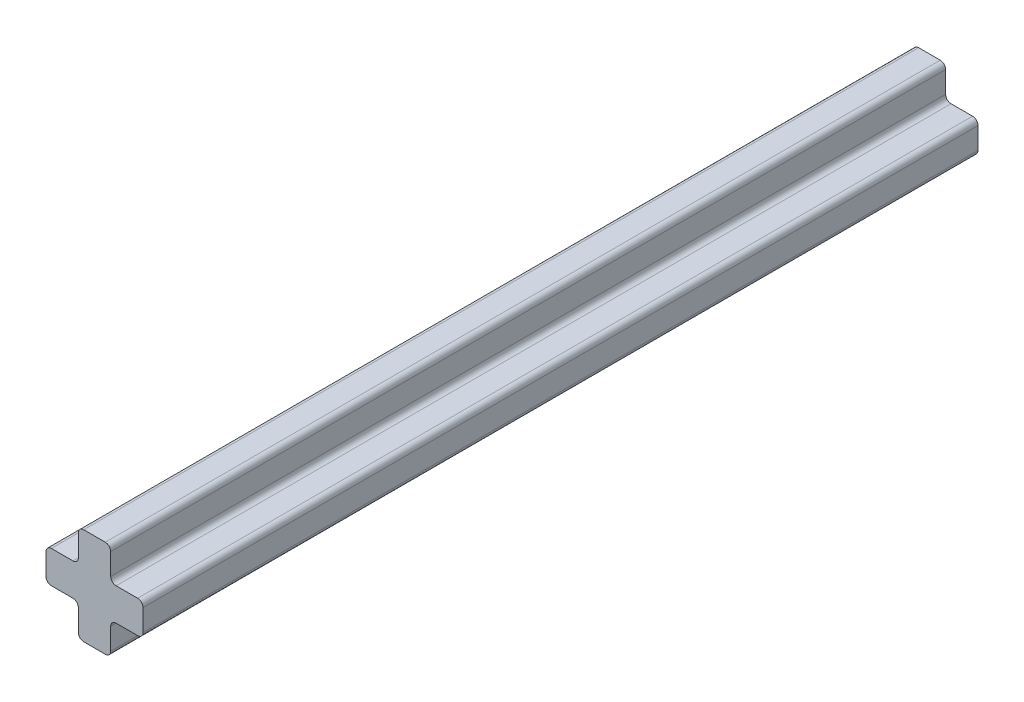
ISO-10303-21;
HEADER;
FILE_DESCRIPTION(('STEP AP214'),'2;1');
FILE_NAME('part.step','',(''),(''),'','','');
FILE_SCHEMA(('AUTOMOTIVE_DESIGN { 1 0 10303 214 1 1 1 1 }'));
ENDSEC;
DATA;
#1=APPLICATION_CONTEXT('core data for automotive mechanical design processes');
#2=APPLICATION_PROTOCOL_DEFINITION('international standard','automotive_design',2000,#1);
#3=PRODUCT_CONTEXT('',#1,'mechanical');
#4=PRODUCT('Part','Part','',(#3));
#5=PRODUCT_RELATED_PRODUCT_CATEGORY('part','',(#4));
#6=PRODUCT_DEFINITION_FORMATION('','',#4);
#7=PRODUCT_DEFINITION_CONTEXT('part definition',#1,'design');
#8=PRODUCT_DEFINITION('design','',#6,#7);
#9=PRODUCT_DEFINITION_SHAPE('','',#8);
#10=(LENGTH_UNIT() NAMED_UNIT(*) SI_UNIT(.MILLI.,.METRE.));
#11=(NAMED_UNIT(*) PLANE_ANGLE_UNIT() SI_UNIT($,.RADIAN.));
#12=(NAMED_UNIT(*) SI_UNIT($,.STERADIAN.) SOLID_ANGLE_UNIT());
#13=UNCERTAINTY_MEASURE_WITH_UNIT(LENGTH_MEASURE(1.E-05),#10,'distance_accuracy_value','');
#14=(GEOMETRIC_REPRESENTATION_CONTEXT(3) GLOBAL_UNCERTAINTY_ASSIGNED_CONTEXT((#13)) GLOBAL_UNIT_ASSIGNED_CONTEXT((#10,
#11,#12)) REPRESENTATION_CONTEXT('',''));
#15=CARTESIAN_POINT('',(0.,0.,0.));
#16=DIRECTION('',(0.,0.,1.));
#17=DIRECTION('',(1.,0.,0.));
#18=AXIS2_PLACEMENT_3D('',#15,#16,#17);
#19=CARTESIAN_POINT('',(-1.01599999999999,1.01599999999999,39.325));
#20=DIRECTION('',(0.,0.,-1.));
#21=DIRECTION('',(-1.,0.,0.));
#22=AXIS2_PLACEMENT_3D('',#19,#20,#21);
#23=CYLINDRICAL_SURFACE('',#22,0.253999999999999);
#24=CARTESIAN_POINT('',(-1.01599999999999,1.01599999999999,0.));
#25=DIRECTION('',(0.,0.,-1.));
#26=DIRECTION('',(-1.,0.,0.));
#27=AXIS2_PLACEMENT_3D('',#24,#25,#26);
#28=CIRCLE('',#27,0.253999999999999);
#29=CARTESIAN_POINT('',(-0.761999999999992,1.01599999999999,0.));
#30=VERTEX_POINT('',#29);
#31=CARTESIAN_POINT('',(-1.01599999999999,0.761999999999992,0.));
#32=VERTEX_POINT('',#31);
#33=EDGE_CURVE('E222',#30,#32,#28,.T.);
#34=ORIENTED_EDGE('',*,*,#33,.T.);
#35=DIRECTION('',(0.,0.,-1.));
#36=VECTOR('',#35,1.);
#37=CARTESIAN_POINT('',(-1.01599999999999,0.761999999999992,39.325));
#38=LINE('',#37,#36);
#39=CARTESIAN_POINT('',(-1.01599999999999,0.761999999999992,39.325));
#40=VERTEX_POINT('',#39);
#41=EDGE_CURVE('E11',#40,#32,#38,.T.);
#42=ORIENTED_EDGE('',*,*,#41,.F.);
#43=CARTESIAN_POINT('',(-1.01599999999999,1.01599999999999,39.325));
#44=DIRECTION('',(0.,0.,-1.));
#45=DIRECTION('',(-1.,0.,0.));
#46=AXIS2_PLACEMENT_3D('',#43,#44,#45);
#47=CIRCLE('',#46,0.253999999999999);
#48=CARTESIAN_POINT('',(-0.761999999999992,1.01599999999999,39.325));
#49=VERTEX_POINT('',#48);
#50=EDGE_CURVE('E268',#49,#40,#47,.T.);
#51=ORIENTED_EDGE('',*,*,#50,.F.);
#52=DIRECTION('',(0.,0.,-1.));
#53=VECTOR('',#52,1.);
#54=CARTESIAN_POINT('',(-0.761999999999992,1.01599999999999,39.325));
#55=LINE('',#54,#53);
#56=EDGE_CURVE('E218',#49,#30,#55,.T.);
#57=ORIENTED_EDGE('',*,*,#56,.T.);
#58=EDGE_LOOP('',(#34,#42,#51,#57));
#59=FACE_BOUND('',#58,.T.);
#60=ADVANCED_FACE('F30',(#59),#23,.F.);
#61=CARTESIAN_POINT('',(-1.01599999999999,0.761999999999992,39.325));
#62=DIRECTION('',(0.,-1.,0.));
#63=DIRECTION('',(0.,0.,-1.));
#64=AXIS2_PLACEMENT_3D('',#61,#62,#63);
#65=PLANE('',#64);
#66=DIRECTION('',(-1.,0.,0.));
#67=VECTOR('',#66,1.);
#68=CARTESIAN_POINT('',(-1.01599999999999,0.761999999999992,0.));
#69=LINE('',#68,#67);
#70=CARTESIAN_POINT('',(-2.032,0.761999999999994,0.));
#71=VERTEX_POINT('',#70);
#72=EDGE_CURVE('E225',#32,#71,#69,.T.);
#73=ORIENTED_EDGE('',*,*,#72,.T.);
#74=DIRECTION('',(0.,0.,-1.));
#75=VECTOR('',#74,1.);
#76=CARTESIAN_POINT('',(-2.032,0.761999999999994,39.325));
#77=LINE('',#76,#75);
#78=CARTESIAN_POINT('',(-2.032,0.761999999999994,39.325));
#79=VERTEX_POINT('',#78);
#80=EDGE_CURVE('E38',#79,#71,#77,.T.);
#81=ORIENTED_EDGE('',*,*,#80,.F.);
#82=DIRECTION('',(-1.,0.,0.));
#83=VECTOR('',#82,1.);
#84=CARTESIAN_POINT('',(-1.01599999999999,0.761999999999992,39.325));
#85=LINE('',#84,#83);
#86=EDGE_CURVE('E137',#40,#79,#85,.T.);
#87=ORIENTED_EDGE('',*,*,#86,.F.);
#88=ORIENTED_EDGE('',*,*,#41,.T.);
#89=EDGE_LOOP('',(#73,#81,#87,#88));
#90=FACE_BOUND('',#89,.T.);
#91=ADVANCED_FACE('F406',(#90),#65,.F.);
#92=CARTESIAN_POINT('',(-2.032,0.507999999999998,39.325));
#93=DIRECTION('',(0.,0.,-1.));
#94=DIRECTION('',(-1.,0.,0.));
#95=AXIS2_PLACEMENT_3D('',#92,#93,#94);
#96=CYLINDRICAL_SURFACE('',#95,0.253999999999996);
#97=CARTESIAN_POINT('',(-2.032,0.507999999999998,0.));
#98=DIRECTION('',(0.,0.,1.));
#99=DIRECTION('',(-1.,0.,0.));
#100=AXIS2_PLACEMENT_3D('',#97,#98,#99);
#101=CIRCLE('',#100,0.253999999999996);
#102=CARTESIAN_POINT('',(-2.286,0.507999999999998,0.));
#103=VERTEX_POINT('',#102);
#104=EDGE_CURVE('E227',#71,#103,#101,.T.);
#105=ORIENTED_EDGE('',*,*,#104,.T.);
#106=DIRECTION('',(0.,0.,-1.));
#107=VECTOR('',#106,1.);
#108=CARTESIAN_POINT('',(-2.286,0.507999999999998,39.325));
#109=LINE('',#108,#107);
#110=CARTESIAN_POINT('',(-2.286,0.507999999999998,39.325));
#111=VERTEX_POINT('',#110);
#112=EDGE_CURVE('E323',#111,#103,#109,.T.);
#113=ORIENTED_EDGE('',*,*,#112,.F.);
#114=CARTESIAN_POINT('',(-2.032,0.507999999999998,39.325));
#115=DIRECTION('',(0.,0.,1.));
#116=DIRECTION('',(-1.,0.,0.));
#117=AXIS2_PLACEMENT_3D('',#114,#115,#116);
#118=CIRCLE('',#117,0.253999999999996);
#119=EDGE_CURVE('E331',#79,#111,#118,.T.);
#120=ORIENTED_EDGE('',*,*,#119,.F.);
#121=ORIENTED_EDGE('',*,*,#80,.T.);
#122=EDGE_LOOP('',(#105,#113,#120,#121));
#123=FACE_BOUND('',#122,.T.);
#124=ADVANCED_FACE('F329',(#123),#96,.T.);
#125=CARTESIAN_POINT('',(-2.286,0.507999999999998,39.325));
#126=DIRECTION('',(1.,0.,0.));
#127=DIRECTION('',(0.,0.,-1.));
#128=AXIS2_PLACEMENT_3D('',#125,#126,#127);
#129=PLANE('',#128);
#130=DIRECTION('',(0.,-1.,0.));
#131=VECTOR('',#130,1.);
#132=CARTESIAN_POINT('',(-2.286,0.507999999999998,0.));
#133=LINE('',#132,#131);
#134=CARTESIAN_POINT('',(-2.28599999999999,-0.507999999999998,0.));
#135=VERTEX_POINT('',#134);
#136=EDGE_CURVE('E229',#103,#135,#133,.T.);
#137=ORIENTED_EDGE('',*,*,#136,.T.);
#138=DIRECTION('',(0.,0.,-1.));
#139=VECTOR('',#138,1.);
#140=CARTESIAN_POINT('',(-2.28599999999999,-0.507999999999998,39.325));
#141=LINE('',#140,#139);
#142=CARTESIAN_POINT('',(-2.28599999999999,-0.507999999999998,39.325));
#143=VERTEX_POINT('',#142);
#144=EDGE_CURVE('E320',#143,#135,#141,.T.);
#145=ORIENTED_EDGE('',*,*,#144,.F.);
#146=DIRECTION('',(0.,-1.,0.));
#147=VECTOR('',#146,1.);
#148=CARTESIAN_POINT('',(-2.286,0.507999999999998,39.325));
#149=LINE('',#148,#147);
#150=EDGE_CURVE('E349',#111,#143,#149,.T.);
#151=ORIENTED_EDGE('',*,*,#150,.F.);
#152=ORIENTED_EDGE('',*,*,#112,.T.);
#153=EDGE_LOOP('',(#137,#145,#151,#152));
#154=FACE_BOUND('',#153,.T.);
#155=ADVANCED_FACE('F340',(#154),#129,.F.);
#156=CARTESIAN_POINT('',(-2.032,-0.507999999999998,39.325));
#157=DIRECTION('',(0.,0.,-1.));
#158=DIRECTION('',(-1.,0.,0.));
#159=AXIS2_PLACEMENT_3D('',#156,#157,#158);
#160=CYLINDRICAL_SURFACE('',#159,0.253999999999996);
#161=CARTESIAN_POINT('',(-2.032,-0.507999999999998,0.));
#162=DIRECTION('',(0.,0.,1.));
#163=DIRECTION('',(-1.,0.,0.));
#164=AXIS2_PLACEMENT_3D('',#161,#162,#163);
#165=CIRCLE('',#164,0.253999999999996);
#166=CARTESIAN_POINT('',(-2.032,-0.761999999999992,0.));
#167=VERTEX_POINT('',#166);
#168=EDGE_CURVE('E231',#135,#167,#165,.T.);
#169=ORIENTED_EDGE('',*,*,#168,.T.);
#170=DIRECTION('',(0.,0.,-1.));
#171=VECTOR('',#170,1.);
#172=CARTESIAN_POINT('',(-2.032,-0.761999999999992,39.325));
#173=LINE('',#172,#171);
#174=CARTESIAN_POINT('',(-2.032,-0.761999999999992,39.325));
#175=VERTEX_POINT('',#174);
#176=EDGE_CURVE('E317',#175,#167,#173,.T.);
#177=ORIENTED_EDGE('',*,*,#176,.F.);
#178=CARTESIAN_POINT('',(-2.032,-0.507999999999998,39.325));
#179=DIRECTION('',(0.,0.,1.));
#180=DIRECTION('',(-1.,0.,0.));
#181=AXIS2_PLACEMENT_3D('',#178,#179,#180);
#182=CIRCLE('',#181,0.253999999999996);
#183=EDGE_CURVE('E346',#143,#175,#182,.T.);
#184=ORIENTED_EDGE('',*,*,#183,.F.);
#185=ORIENTED_EDGE('',*,*,#144,.T.);
#186=EDGE_LOOP('',(#169,#177,#184,#185));
#187=FACE_BOUND('',#186,.T.);
#188=ADVANCED_FACE('F344',(#187),#160,.T.);
#189=CARTESIAN_POINT('',(-2.032,-0.761999999999992,39.325));
#190=DIRECTION('',(0.,1.,0.));
#191=DIRECTION('',(-1.,0.,0.));
#192=AXIS2_PLACEMENT_3D('',#189,#190,#191);
#193=PLANE('',#192);
#194=DIRECTION('',(1.,0.,0.));
#195=VECTOR('',#194,1.);
#196=CARTESIAN_POINT('',(-2.032,-0.761999999999992,0.));
#197=LINE('',#196,#195);
#198=CARTESIAN_POINT('',(-1.01599999999999,-0.762000000000001,0.));
#199=VERTEX_POINT('',#198);
#200=EDGE_CURVE('E233',#167,#199,#197,.T.);
#201=ORIENTED_EDGE('',*,*,#200,.T.);
#202=DIRECTION('',(0.,0.,-1.));
#203=VECTOR('',#202,1.);
#204=CARTESIAN_POINT('',(-1.01599999999999,-0.762000000000001,39.325));
#205=LINE('',#204,#203);
#206=CARTESIAN_POINT('',(-1.01599999999999,-0.762000000000001,39.325));
#207=VERTEX_POINT('',#206);
#208=EDGE_CURVE('E314',#207,#199,#205,.T.);
#209=ORIENTED_EDGE('',*,*,#208,.F.);
#210=DIRECTION('',(1.,0.,0.));
#211=VECTOR('',#210,1.);
#212=CARTESIAN_POINT('',(-2.032,-0.761999999999992,39.325));
#213=LINE('',#212,#211);
#214=EDGE_CURVE('E348',#175,#207,#213,.T.);
#215=ORIENTED_EDGE('',*,*,#214,.F.);
#216=ORIENTED_EDGE('',*,*,#176,.T.);
#217=EDGE_LOOP('',(#201,#209,#215,#216));
#218=FACE_BOUND('',#217,.T.);
#219=ADVANCED_FACE('F419',(#218),#193,.F.);
#220=CARTESIAN_POINT('',(-1.01599999999999,-1.016,39.325));
#221=DIRECTION('',(0.,0.,-1.));
#222=DIRECTION('',(-1.,0.,0.));
#223=AXIS2_PLACEMENT_3D('',#220,#221,#222);
#224=CYLINDRICAL_SURFACE('',#223,0.253999999999999);
#225=CARTESIAN_POINT('',(-1.01599999999999,-1.016,0.));
#226=DIRECTION('',(0.,0.,-1.));
#227=DIRECTION('',(-1.,0.,0.));
#228=AXIS2_PLACEMENT_3D('',#225,#226,#227);
#229=CIRCLE('',#228,0.253999999999999);
#230=CARTESIAN_POINT('',(-0.761999999999992,-1.016,0.));
#231=VERTEX_POINT('',#230);
#232=EDGE_CURVE('E235',#199,#231,#229,.T.);
#233=ORIENTED_EDGE('',*,*,#232,.T.);
#234=DIRECTION('',(0.,0.,-1.));
#235=VECTOR('',#234,1.);
#236=CARTESIAN_POINT('',(-0.761999999999992,-1.016,39.325));
#237=LINE('',#236,#235);
#238=CARTESIAN_POINT('',(-0.761999999999992,-1.016,39.325));
#239=VERTEX_POINT('',#238);
#240=EDGE_CURVE('E311',#239,#231,#237,.T.);
#241=ORIENTED_EDGE('',*,*,#240,.F.);
#242=CARTESIAN_POINT('',(-1.01599999999999,-1.016,39.325));
#243=DIRECTION('',(0.,0.,-1.));
#244=DIRECTION('',(-1.,0.,0.));
#245=AXIS2_PLACEMENT_3D('',#242,#243,#244);
#246=CIRCLE('',#245,0.253999999999999);
#247=EDGE_CURVE('E351',#207,#239,#246,.T.);
#248=ORIENTED_EDGE('',*,*,#247,.F.);
#249=ORIENTED_EDGE('',*,*,#208,.T.);
#250=EDGE_LOOP('',(#233,#241,#248,#249));
#251=FACE_BOUND('',#250,.T.);
#252=ADVANCED_FACE('F422',(#251),#224,.F.);
#253=CARTESIAN_POINT('',(-0.761999999999992,-1.016,39.325));
#254=DIRECTION('',(1.,0.,0.));
#255=DIRECTION('',(0.,0.,-1.));
#256=AXIS2_PLACEMENT_3D('',#253,#254,#255);
#257=PLANE('',#256);
#258=DIRECTION('',(0.,-1.,0.));
#259=VECTOR('',#258,1.);
#260=CARTESIAN_POINT('',(-0.761999999999992,-1.016,0.));
#261=LINE('',#260,#259);
#262=CARTESIAN_POINT('',(-0.761999999999992,-2.032,0.));
#263=VERTEX_POINT('',#262);
#264=EDGE_CURVE('E237',#231,#263,#261,.T.);
#265=ORIENTED_EDGE('',*,*,#264,.T.);
#266=DIRECTION('',(0.,0.,-1.));
#267=VECTOR('',#266,1.);
#268=CARTESIAN_POINT('',(-0.761999999999992,-2.032,39.325));
#269=LINE('',#268,#267);
#270=CARTESIAN_POINT('',(-0.761999999999992,-2.032,39.325));
#271=VERTEX_POINT('',#270);
#272=EDGE_CURVE('E308',#271,#263,#269,.T.);
#273=ORIENTED_EDGE('',*,*,#272,.F.);
#274=DIRECTION('',(0.,-1.,0.));
#275=VECTOR('',#274,1.);
#276=CARTESIAN_POINT('',(-0.761999999999992,-1.016,39.325));
#277=LINE('',#276,#275);
#278=EDGE_CURVE('E357',#239,#271,#277,.T.);
#279=ORIENTED_EDGE('',*,*,#278,.F.);
#280=ORIENTED_EDGE('',*,*,#240,.T.);
#281=EDGE_LOOP('',(#265,#273,#279,#280));
#282=FACE_BOUND('',#281,.T.);
#283=ADVANCED_FACE('F426',(#282),#257,.F.);
#284=CARTESIAN_POINT('',(-0.507999999999995,-2.032,39.325));
#285=DIRECTION('',(0.,0.,-1.));
#286=DIRECTION('',(-1.,0.,0.));
#287=AXIS2_PLACEMENT_3D('',#284,#285,#286);
#288=CYLINDRICAL_SURFACE('',#287,0.253999999999997);
#289=CARTESIAN_POINT('',(-0.507999999999995,-2.032,0.));
#290=DIRECTION('',(0.,0.,1.));
#291=DIRECTION('',(-1.,0.,0.));
#292=AXIS2_PLACEMENT_3D('',#289,#290,#291);
#293=CIRCLE('',#292,0.253999999999997);
#294=CARTESIAN_POINT('',(-0.507999999999995,-2.28599999999999,0.));
#295=VERTEX_POINT('',#294);
#296=EDGE_CURVE('E239',#263,#295,#293,.T.);
#297=ORIENTED_EDGE('',*,*,#296,.T.);
#298=DIRECTION('',(0.,0.,-1.));
#299=VECTOR('',#298,1.);
#300=CARTESIAN_POINT('',(-0.507999999999995,-2.28599999999999,39.325));
#301=LINE('',#300,#299);
#302=CARTESIAN_POINT('',(-0.507999999999995,-2.28599999999999,39.325));
#303=VERTEX_POINT('',#302);
#304=EDGE_CURVE('E305',#303,#295,#301,.T.);
#305=ORIENTED_EDGE('',*,*,#304,.F.);
#306=CARTESIAN_POINT('',(-0.507999999999995,-2.032,39.325));
#307=DIRECTION('',(0.,0.,1.));
#308=DIRECTION('',(-1.,0.,0.));
#309=AXIS2_PLACEMENT_3D('',#306,#307,#308);
#310=CIRCLE('',#309,0.253999999999997);
#311=EDGE_CURVE('E359',#271,#303,#310,.T.);
#312=ORIENTED_EDGE('',*,*,#311,.F.);
#313=ORIENTED_EDGE('',*,*,#272,.T.);
#314=EDGE_LOOP('',(#297,#305,#312,#313));
#315=FACE_BOUND('',#314,.T.);
#316=ADVANCED_FACE('F430',(#315),#288,.T.);
#317=CARTESIAN_POINT('',(-0.507999999999995,-2.28599999999999,39.325));
#318=DIRECTION('',(0.,1.,0.));
#319=DIRECTION('',(0.,0.,1.));
#320=AXIS2_PLACEMENT_3D('',#317,#318,#319);
#321=PLANE('',#320);
#322=DIRECTION('',(1.,0.,0.));
#323=VECTOR('',#322,1.);
#324=CARTESIAN_POINT('',(-0.507999999999995,-2.28599999999999,0.));
#325=LINE('',#324,#323);
#326=CARTESIAN_POINT('',(0.508000000000002,-2.28599999999999,0.));
#327=VERTEX_POINT('',#326);
#328=EDGE_CURVE('E241',#295,#327,#325,.T.);
#329=ORIENTED_EDGE('',*,*,#328,.T.);
#330=DIRECTION('',(0.,0.,-1.));
#331=VECTOR('',#330,1.);
#332=CARTESIAN_POINT('',(0.508000000000002,-2.28599999999999,39.325));
#333=LINE('',#332,#331);
#334=CARTESIAN_POINT('',(0.508000000000002,-2.28599999999999,39.325));
#335=VERTEX_POINT('',#334);
#336=EDGE_CURVE('E302',#335,#327,#333,.T.);
#337=ORIENTED_EDGE('',*,*,#336,.F.);
#338=DIRECTION('',(1.,0.,0.));
#339=VECTOR('',#338,1.);
#340=CARTESIAN_POINT('',(-0.507999999999995,-2.28599999999999,39.325));
#341=LINE('',#340,#339);
#342=EDGE_CURVE('E361',#303,#335,#341,.T.);
#343=ORIENTED_EDGE('',*,*,#342,.F.);
#344=ORIENTED_EDGE('',*,*,#304,.T.);
#345=EDGE_LOOP('',(#329,#337,#343,#344));
#346=FACE_BOUND('',#345,.T.);
#347=ADVANCED_FACE('F434',(#346),#321,.F.);
#348=CARTESIAN_POINT('',(0.508000000000002,-2.032,39.325));
#349=DIRECTION('',(0.,0.,-1.));
#350=DIRECTION('',(-1.,0.,0.));
#351=AXIS2_PLACEMENT_3D('',#348,#349,#350);
#352=CYLINDRICAL_SURFACE('',#351,0.253999999999997);
#353=CARTESIAN_POINT('',(0.508000000000002,-2.032,0.));
#354=DIRECTION('',(0.,0.,1.));
#355=DIRECTION('',(-1.,0.,0.));
#356=AXIS2_PLACEMENT_3D('',#353,#354,#355);
#357=CIRCLE('',#356,0.253999999999997);
#358=CARTESIAN_POINT('',(0.761999999999999,-2.032,0.));
#359=VERTEX_POINT('',#358);
#360=EDGE_CURVE('E243',#327,#359,#357,.T.);
#361=ORIENTED_EDGE('',*,*,#360,.T.);
#362=DIRECTION('',(0.,0.,-1.));
#363=VECTOR('',#362,1.);
#364=CARTESIAN_POINT('',(0.761999999999999,-2.032,39.325));
#365=LINE('',#364,#363);
#366=CARTESIAN_POINT('',(0.761999999999999,-2.032,39.325));
#367=VERTEX_POINT('',#366);
#368=EDGE_CURVE('E299',#367,#359,#365,.T.);
#369=ORIENTED_EDGE('',*,*,#368,.F.);
#370=CARTESIAN_POINT('',(0.508000000000002,-2.032,39.325));
#371=DIRECTION('',(0.,0.,1.));
#372=DIRECTION('',(-1.,0.,0.));
#373=AXIS2_PLACEMENT_3D('',#370,#371,#372);
#374=CIRCLE('',#373,0.253999999999997);
#375=EDGE_CURVE('E363',#335,#367,#374,.T.);
#376=ORIENTED_EDGE('',*,*,#375,.F.);
#377=ORIENTED_EDGE('',*,*,#336,.T.);
#378=EDGE_LOOP('',(#361,#369,#376,#377));
#379=FACE_BOUND('',#378,.T.);
#380=ADVANCED_FACE('F438',(#379),#352,.T.);
#381=CARTESIAN_POINT('',(0.761999999999999,-2.032,39.325));
#382=DIRECTION('',(-1.,0.,0.));
#383=DIRECTION('',(0.,0.,1.));
#384=AXIS2_PLACEMENT_3D('',#381,#382,#383);
#385=PLANE('',#384);
#386=DIRECTION('',(0.,1.,0.));
#387=VECTOR('',#386,1.);
#388=CARTESIAN_POINT('',(0.761999999999999,-2.032,0.));
#389=LINE('',#388,#387);
#390=CARTESIAN_POINT('',(0.761999999999997,-1.016,0.));
#391=VERTEX_POINT('',#390);
#392=EDGE_CURVE('E245',#359,#391,#389,.T.);
#393=ORIENTED_EDGE('',*,*,#392,.T.);
#394=DIRECTION('',(0.,0.,-1.));
#395=VECTOR('',#394,1.);
#396=CARTESIAN_POINT('',(0.761999999999997,-1.016,39.325));
#397=LINE('',#396,#395);
#398=CARTESIAN_POINT('',(0.761999999999997,-1.016,39.325));
#399=VERTEX_POINT('',#398);
#400=EDGE_CURVE('E296',#399,#391,#397,.T.);
#401=ORIENTED_EDGE('',*,*,#400,.F.);
#402=DIRECTION('',(0.,1.,0.));
#403=VECTOR('',#402,1.);
#404=CARTESIAN_POINT('',(0.761999999999999,-2.032,39.325));
#405=LINE('',#404,#403);
#406=EDGE_CURVE('E365',#367,#399,#405,.T.);
#407=ORIENTED_EDGE('',*,*,#406,.F.);
#408=ORIENTED_EDGE('',*,*,#368,.T.);
#409=EDGE_LOOP('',(#393,#401,#407,#408));
#410=FACE_BOUND('',#409,.T.);
#411=ADVANCED_FACE('F442',(#410),#385,.F.);
#412=CARTESIAN_POINT('',(1.016,-1.016,39.325));
#413=DIRECTION('',(0.,0.,-1.));
#414=DIRECTION('',(-1.,0.,0.));
#415=AXIS2_PLACEMENT_3D('',#412,#413,#414);
#416=CYLINDRICAL_SURFACE('',#415,0.253999999999999);
#417=CARTESIAN_POINT('',(1.016,-1.016,0.));
#418=DIRECTION('',(0.,0.,-1.));
#419=DIRECTION('',(1.,0.,0.));
#420=AXIS2_PLACEMENT_3D('',#417,#418,#419);
#421=CIRCLE('',#420,0.253999999999999);
#422=CARTESIAN_POINT('',(1.016,-0.761999999999999,0.));
#423=VERTEX_POINT('',#422);
#424=EDGE_CURVE('E247',#391,#423,#421,.T.);
#425=ORIENTED_EDGE('',*,*,#424,.T.);
#426=DIRECTION('',(0.,0.,-1.));
#427=VECTOR('',#426,1.);
#428=CARTESIAN_POINT('',(1.016,-0.761999999999999,39.325));
#429=LINE('',#428,#427);
#430=CARTESIAN_POINT('',(1.016,-0.761999999999999,39.325));
#431=VERTEX_POINT('',#430);
#432=EDGE_CURVE('E293',#431,#423,#429,.T.);
#433=ORIENTED_EDGE('',*,*,#432,.F.);
#434=CARTESIAN_POINT('',(1.016,-1.016,39.325));
#435=DIRECTION('',(0.,0.,-1.));
#436=DIRECTION('',(1.,0.,0.));
#437=AXIS2_PLACEMENT_3D('',#434,#435,#436);
#438=CIRCLE('',#437,0.253999999999999);
#439=EDGE_CURVE('E367',#399,#431,#438,.T.);
#440=ORIENTED_EDGE('',*,*,#439,.F.);
#441=ORIENTED_EDGE('',*,*,#400,.T.);
#442=EDGE_LOOP('',(#425,#433,#440,#441));
#443=FACE_BOUND('',#442,.T.);
#444=ADVANCED_FACE('F446',(#443),#416,.F.);
#445=CARTESIAN_POINT('',(1.016,-0.761999999999999,39.325));
#446=DIRECTION('',(0.,1.,0.));
#447=DIRECTION('',(0.,0.,1.));
#448=AXIS2_PLACEMENT_3D('',#445,#446,#447);
#449=PLANE('',#448);
#450=DIRECTION('',(1.,0.,0.));
#451=VECTOR('',#450,1.);
#452=CARTESIAN_POINT('',(1.016,-0.761999999999999,0.));
#453=LINE('',#452,#451);
#454=CARTESIAN_POINT('',(2.03200000000001,-0.761999999999999,0.));
#455=VERTEX_POINT('',#454);
#456=EDGE_CURVE('E249',#423,#455,#453,.T.);
#457=ORIENTED_EDGE('',*,*,#456,.T.);
#458=DIRECTION('',(0.,0.,-1.));
#459=VECTOR('',#458,1.);
#460=CARTESIAN_POINT('',(2.03200000000001,-0.761999999999999,39.325));
#461=LINE('',#460,#459);
#462=CARTESIAN_POINT('',(2.03200000000001,-0.761999999999999,39.325));
#463=VERTEX_POINT('',#462);
#464=EDGE_CURVE('E290',#463,#455,#461,.T.);
#465=ORIENTED_EDGE('',*,*,#464,.F.);
#466=DIRECTION('',(1.,0.,0.));
#467=VECTOR('',#466,1.);
#468=CARTESIAN_POINT('',(1.016,-0.761999999999999,39.325));
#469=LINE('',#468,#467);
#470=EDGE_CURVE('E369',#431,#463,#469,.T.);
#471=ORIENTED_EDGE('',*,*,#470,.F.);
#472=ORIENTED_EDGE('',*,*,#432,.T.);
#473=EDGE_LOOP('',(#457,#465,#471,#472));
#474=FACE_BOUND('',#473,.T.);
#475=ADVANCED_FACE('F450',(#474),#449,.F.);
#476=CARTESIAN_POINT('',(2.03200000000001,-0.508000000000002,39.325));
#477=DIRECTION('',(0.,0.,-1.));
#478=DIRECTION('',(-1.,0.,0.));
#479=AXIS2_PLACEMENT_3D('',#476,#477,#478);
#480=CYLINDRICAL_SURFACE('',#479,0.253999999999997);
#481=CARTESIAN_POINT('',(2.03200000000001,-0.508000000000002,0.));
#482=DIRECTION('',(0.,0.,1.));
#483=DIRECTION('',(1.,0.,0.));
#484=AXIS2_PLACEMENT_3D('',#481,#482,#483);
#485=CIRCLE('',#484,0.253999999999997);
#486=CARTESIAN_POINT('',(2.286,-0.508000000000002,0.));
#487=VERTEX_POINT('',#486);
#488=EDGE_CURVE('E251',#455,#487,#485,.T.);
#489=ORIENTED_EDGE('',*,*,#488,.T.);
#490=DIRECTION('',(0.,0.,-1.));
#491=VECTOR('',#490,1.);
#492=CARTESIAN_POINT('',(2.286,-0.508000000000002,39.325));
#493=LINE('',#492,#491);
#494=CARTESIAN_POINT('',(2.286,-0.508000000000002,39.325));
#495=VERTEX_POINT('',#494);
#496=EDGE_CURVE('E287',#495,#487,#493,.T.);
#497=ORIENTED_EDGE('',*,*,#496,.F.);
#498=CARTESIAN_POINT('',(2.03200000000001,-0.508000000000002,39.325));
#499=DIRECTION('',(0.,0.,1.));
#500=DIRECTION('',(1.,0.,0.));
#501=AXIS2_PLACEMENT_3D('',#498,#499,#500);
#502=CIRCLE('',#501,0.253999999999997);
#503=EDGE_CURVE('E371',#463,#495,#502,.T.);
#504=ORIENTED_EDGE('',*,*,#503,.F.);
#505=ORIENTED_EDGE('',*,*,#464,.T.);
#506=EDGE_LOOP('',(#489,#497,#504,#505));
#507=FACE_BOUND('',#506,.T.);
#508=ADVANCED_FACE('F454',(#507),#480,.T.);
#509=CARTESIAN_POINT('',(2.286,-0.508000000000002,39.325));
#510=DIRECTION('',(-1.,0.,0.));
#511=DIRECTION('',(0.,0.,1.));
#512=AXIS2_PLACEMENT_3D('',#509,#510,#511);
#513=PLANE('',#512);
#514=DIRECTION('',(0.,1.,0.));
#515=VECTOR('',#514,1.);
#516=CARTESIAN_POINT('',(2.286,-0.508000000000002,0.));
#517=LINE('',#516,#515);
#518=CARTESIAN_POINT('',(2.286,0.508000000000001,0.));
#519=VERTEX_POINT('',#518);
#520=EDGE_CURVE('E253',#487,#519,#517,.T.);
#521=ORIENTED_EDGE('',*,*,#520,.T.);
#522=DIRECTION('',(0.,0.,-1.));
#523=VECTOR('',#522,1.);
#524=CARTESIAN_POINT('',(2.286,0.508000000000001,39.325));
#525=LINE('',#524,#523);
#526=CARTESIAN_POINT('',(2.286,0.508000000000001,39.325));
#527=VERTEX_POINT('',#526);
#528=EDGE_CURVE('E284',#527,#519,#525,.T.);
#529=ORIENTED_EDGE('',*,*,#528,.F.);
#530=DIRECTION('',(0.,1.,0.));
#531=VECTOR('',#530,1.);
#532=CARTESIAN_POINT('',(2.286,-0.508000000000002,39.325));
#533=LINE('',#532,#531);
#534=EDGE_CURVE('E373',#495,#527,#533,.T.);
#535=ORIENTED_EDGE('',*,*,#534,.F.);
#536=ORIENTED_EDGE('',*,*,#496,.T.);
#537=EDGE_LOOP('',(#521,#529,#535,#536));
#538=FACE_BOUND('',#537,.T.);
#539=ADVANCED_FACE('F458',(#538),#513,.F.);
#540=CARTESIAN_POINT('',(2.03200000000001,0.507999999999998,39.325));
#541=DIRECTION('',(0.,0.,-1.));
#542=DIRECTION('',(-1.,0.,0.));
#543=AXIS2_PLACEMENT_3D('',#540,#541,#542);
#544=CYLINDRICAL_SURFACE('',#543,0.253999999999999);
#545=CARTESIAN_POINT('',(2.03200000000001,0.507999999999998,0.));
#546=DIRECTION('',(0.,0.,1.));
#547=DIRECTION('',(-1.,0.,0.));
#548=AXIS2_PLACEMENT_3D('',#545,#546,#547);
#549=CIRCLE('',#548,0.253999999999999);
#550=CARTESIAN_POINT('',(2.03200000000001,0.761999999999999,0.));
#551=VERTEX_POINT('',#550);
#552=EDGE_CURVE('E255',#519,#551,#549,.T.);
#553=ORIENTED_EDGE('',*,*,#552,.T.);
#554=DIRECTION('',(0.,0.,-1.));
#555=VECTOR('',#554,1.);
#556=CARTESIAN_POINT('',(2.03200000000001,0.761999999999999,39.325));
#557=LINE('',#556,#555);
#558=CARTESIAN_POINT('',(2.03200000000001,0.761999999999999,39.325));
#559=VERTEX_POINT('',#558);
#560=EDGE_CURVE('E281',#559,#551,#557,.T.);
#561=ORIENTED_EDGE('',*,*,#560,.F.);
#562=CARTESIAN_POINT('',(2.03200000000001,0.507999999999998,39.325));
#563=DIRECTION('',(0.,0.,1.));
#564=DIRECTION('',(-1.,0.,0.));
#565=AXIS2_PLACEMENT_3D('',#562,#563,#564);
#566=CIRCLE('',#565,0.253999999999999);
#567=EDGE_CURVE('E375',#527,#559,#566,.T.);
#568=ORIENTED_EDGE('',*,*,#567,.F.);
#569=ORIENTED_EDGE('',*,*,#528,.T.);
#570=EDGE_LOOP('',(#553,#561,#568,#569));
#571=FACE_BOUND('',#570,.T.);
#572=ADVANCED_FACE('F462',(#571),#544,.T.);
#573=CARTESIAN_POINT('',(2.03200000000001,0.761999999999999,39.325));
#574=DIRECTION('',(0.,-1.,0.));
#575=DIRECTION('',(1.,0.,0.));
#576=AXIS2_PLACEMENT_3D('',#573,#574,#575);
#577=PLANE('',#576);
#578=DIRECTION('',(-1.,0.,0.));
#579=VECTOR('',#578,1.);
#580=CARTESIAN_POINT('',(2.03200000000001,0.761999999999999,0.));
#581=LINE('',#580,#579);
#582=CARTESIAN_POINT('',(1.016,0.762000000000004,0.));
#583=VERTEX_POINT('',#582);
#584=EDGE_CURVE('E257',#551,#583,#581,.T.);
#585=ORIENTED_EDGE('',*,*,#584,.T.);
#586=DIRECTION('',(0.,0.,-1.));
#587=VECTOR('',#586,1.);
#588=CARTESIAN_POINT('',(1.016,0.762000000000004,39.325));
#589=LINE('',#588,#587);
#590=CARTESIAN_POINT('',(1.016,0.762000000000004,39.325));
#591=VERTEX_POINT('',#590);
#592=EDGE_CURVE('E278',#591,#583,#589,.T.);
#593=ORIENTED_EDGE('',*,*,#592,.F.);
#594=DIRECTION('',(-1.,0.,0.));
#595=VECTOR('',#594,1.);
#596=CARTESIAN_POINT('',(2.03200000000001,0.761999999999999,39.325));
#597=LINE('',#596,#595);
#598=EDGE_CURVE('E377',#559,#591,#597,.T.);
#599=ORIENTED_EDGE('',*,*,#598,.F.);
#600=ORIENTED_EDGE('',*,*,#560,.T.);
#601=EDGE_LOOP('',(#585,#593,#599,#600));
#602=FACE_BOUND('',#601,.T.);
#603=ADVANCED_FACE('F466',(#602),#577,.F.);
#604=CARTESIAN_POINT('',(1.016,1.016,39.325));
#605=DIRECTION('',(0.,0.,-1.));
#606=DIRECTION('',(-1.,0.,0.));
#607=AXIS2_PLACEMENT_3D('',#604,#605,#606);
#608=CYLINDRICAL_SURFACE('',#607,0.253999999999999);
#609=CARTESIAN_POINT('',(1.016,1.016,0.));
#610=DIRECTION('',(0.,0.,-1.));
#611=DIRECTION('',(1.,0.,0.));
#612=AXIS2_PLACEMENT_3D('',#609,#610,#611);
#613=CIRCLE('',#612,0.253999999999999);
#614=CARTESIAN_POINT('',(0.761999999999999,1.016,0.));
#615=VERTEX_POINT('',#614);
#616=EDGE_CURVE('E259',#583,#615,#613,.T.);
#617=ORIENTED_EDGE('',*,*,#616,.T.);
#618=DIRECTION('',(0.,0.,-1.));
#619=VECTOR('',#618,1.);
#620=CARTESIAN_POINT('',(0.761999999999999,1.016,39.325));
#621=LINE('',#620,#619);
#622=CARTESIAN_POINT('',(0.761999999999999,1.016,39.325));
#623=VERTEX_POINT('',#622);
#624=EDGE_CURVE('E275',#623,#615,#621,.T.);
#625=ORIENTED_EDGE('',*,*,#624,.F.);
#626=CARTESIAN_POINT('',(1.016,1.016,39.325));
#627=DIRECTION('',(0.,0.,-1.));
#628=DIRECTION('',(1.,0.,0.));
#629=AXIS2_PLACEMENT_3D('',#626,#627,#628);
#630=CIRCLE('',#629,0.253999999999999);
#631=EDGE_CURVE('E379',#591,#623,#630,.T.);
#632=ORIENTED_EDGE('',*,*,#631,.F.);
#633=ORIENTED_EDGE('',*,*,#592,.T.);
#634=EDGE_LOOP('',(#617,#625,#632,#633));
#635=FACE_BOUND('',#634,.T.);
#636=ADVANCED_FACE('F470',(#635),#608,.F.);
#637=CARTESIAN_POINT('',(0.761999999999999,1.016,39.325));
#638=DIRECTION('',(-1.,0.,0.));
#639=DIRECTION('',(0.,0.,1.));
#640=AXIS2_PLACEMENT_3D('',#637,#638,#639);
#641=PLANE('',#640);
#642=DIRECTION('',(0.,1.,0.));
#643=VECTOR('',#642,1.);
#644=CARTESIAN_POINT('',(0.761999999999999,1.016,0.));
#645=LINE('',#644,#643);
#646=CARTESIAN_POINT('',(0.762000000000001,2.03199999999999,0.));
#647=VERTEX_POINT('',#646);
#648=EDGE_CURVE('E261',#615,#647,#645,.T.);
#649=ORIENTED_EDGE('',*,*,#648,.T.);
#650=DIRECTION('',(0.,0.,-1.));
#651=VECTOR('',#650,1.);
#652=CARTESIAN_POINT('',(0.762000000000001,2.03199999999999,39.325));
#653=LINE('',#652,#651);
#654=CARTESIAN_POINT('',(0.762000000000001,2.03199999999999,39.325));
#655=VERTEX_POINT('',#654);
#656=EDGE_CURVE('E272',#655,#647,#653,.T.);
#657=ORIENTED_EDGE('',*,*,#656,.F.);
#658=DIRECTION('',(0.,1.,0.));
#659=VECTOR('',#658,1.);
#660=CARTESIAN_POINT('',(0.761999999999999,1.016,39.325));
#661=LINE('',#660,#659);
#662=EDGE_CURVE('E381',#623,#655,#661,.T.);
#663=ORIENTED_EDGE('',*,*,#662,.F.);
#664=ORIENTED_EDGE('',*,*,#624,.T.);
#665=EDGE_LOOP('',(#649,#657,#663,#664));
#666=FACE_BOUND('',#665,.T.);
#667=ADVANCED_FACE('F387',(#666),#641,.F.);
#668=CARTESIAN_POINT('',(0.508000000000002,2.03199999999999,39.325));
#669=DIRECTION('',(0.,0.,-1.));
#670=DIRECTION('',(-1.,0.,0.));
#671=AXIS2_PLACEMENT_3D('',#668,#669,#670);
#672=CYLINDRICAL_SURFACE('',#671,0.253999999999999);
#673=CARTESIAN_POINT('',(0.508000000000002,2.03199999999999,0.));
#674=DIRECTION('',(0.,0.,1.));
#675=DIRECTION('',(-1.,0.,0.));
#676=AXIS2_PLACEMENT_3D('',#673,#674,#675);
#677=CIRCLE('',#676,0.253999999999999);
#678=CARTESIAN_POINT('',(0.508000000000002,2.28599999999999,0.));
#679=VERTEX_POINT('',#678);
#680=EDGE_CURVE('E263',#647,#679,#677,.T.);
#681=ORIENTED_EDGE('',*,*,#680,.T.);
#682=DIRECTION('',(0.,0.,-1.));
#683=VECTOR('',#682,1.);
#684=CARTESIAN_POINT('',(0.508000000000002,2.28599999999999,39.325));
#685=LINE('',#684,#683);
#686=CARTESIAN_POINT('',(0.508000000000002,2.28599999999999,39.325));
#687=VERTEX_POINT('',#686);
#688=EDGE_CURVE('E213',#687,#679,#685,.T.);
#689=ORIENTED_EDGE('',*,*,#688,.F.);
#690=CARTESIAN_POINT('',(0.508000000000002,2.03199999999999,39.325));
#691=DIRECTION('',(0.,0.,1.));
#692=DIRECTION('',(-1.,0.,0.));
#693=AXIS2_PLACEMENT_3D('',#690,#691,#692);
#694=CIRCLE('',#693,0.253999999999999);
#695=EDGE_CURVE('E204',#655,#687,#694,.T.);
#696=ORIENTED_EDGE('',*,*,#695,.F.);
#697=ORIENTED_EDGE('',*,*,#656,.T.);
#698=EDGE_LOOP('',(#681,#689,#696,#697));
#699=FACE_BOUND('',#698,.T.);
#700=ADVANCED_FACE('F391',(#699),#672,.T.);
#701=CARTESIAN_POINT('',(0.508000000000002,2.28599999999999,39.325));
#702=DIRECTION('',(0.,-1.,0.));
#703=DIRECTION('',(0.,0.,-1.));
#704=AXIS2_PLACEMENT_3D('',#701,#702,#703);
#705=PLANE('',#704);
#706=DIRECTION('',(-1.,0.,0.));
#707=VECTOR('',#706,1.);
#708=CARTESIAN_POINT('',(0.508000000000002,2.28599999999999,0.));
#709=LINE('',#708,#707);
#710=CARTESIAN_POINT('',(-0.507999999999995,2.28599999999999,0.));
#711=VERTEX_POINT('',#710);
#712=EDGE_CURVE('E212',#679,#711,#709,.T.);
#713=ORIENTED_EDGE('',*,*,#712,.T.);
#714=DIRECTION('',(0.,0.,-1.));
#715=VECTOR('',#714,1.);
#716=CARTESIAN_POINT('',(-0.507999999999995,2.28599999999999,39.325));
#717=LINE('',#716,#715);
#718=CARTESIAN_POINT('',(-0.507999999999995,2.28599999999999,39.325));
#719=VERTEX_POINT('',#718);
#720=EDGE_CURVE('E209',#719,#711,#717,.T.);
#721=ORIENTED_EDGE('',*,*,#720,.F.);
#722=DIRECTION('',(-1.,0.,0.));
#723=VECTOR('',#722,1.);
#724=CARTESIAN_POINT('',(0.508000000000002,2.28599999999999,39.325));
#725=LINE('',#724,#723);
#726=EDGE_CURVE('E198',#687,#719,#725,.T.);
#727=ORIENTED_EDGE('',*,*,#726,.F.);
#728=ORIENTED_EDGE('',*,*,#688,.T.);
#729=EDGE_LOOP('',(#713,#721,#727,#728));
#730=FACE_BOUND('',#729,.T.);
#731=ADVANCED_FACE('F210',(#730),#705,.F.);
#732=CARTESIAN_POINT('',(-0.507999999999995,2.03199999999999,39.325));
#733=DIRECTION('',(0.,0.,-1.));
#734=DIRECTION('',(-1.,0.,0.));
#735=AXIS2_PLACEMENT_3D('',#732,#733,#734);
#736=CYLINDRICAL_SURFACE('',#735,0.253999999999999);
#737=CARTESIAN_POINT('',(-0.507999999999995,2.03199999999999,0.));
#738=DIRECTION('',(0.,0.,1.));
#739=DIRECTION('',(-1.,0.,0.));
#740=AXIS2_PLACEMENT_3D('',#737,#738,#739);
#741=CIRCLE('',#740,0.253999999999999);
#742=CARTESIAN_POINT('',(-0.761999999999992,2.03199999999999,0.));
#743=VERTEX_POINT('',#742);
#744=EDGE_CURVE('E123',#711,#743,#741,.T.);
#745=ORIENTED_EDGE('',*,*,#744,.T.);
#746=DIRECTION('',(0.,0.,-1.));
#747=VECTOR('',#746,1.);
#748=CARTESIAN_POINT('',(-0.761999999999992,2.03199999999999,39.325));
#749=LINE('',#748,#747);
#750=CARTESIAN_POINT('',(-0.761999999999992,2.03199999999999,39.325));
#751=VERTEX_POINT('',#750);
#752=EDGE_CURVE('E214',#751,#743,#749,.T.);
#753=ORIENTED_EDGE('',*,*,#752,.F.);
#754=CARTESIAN_POINT('',(-0.507999999999995,2.03199999999999,39.325));
#755=DIRECTION('',(0.,0.,1.));
#756=DIRECTION('',(-1.,0.,0.));
#757=AXIS2_PLACEMENT_3D('',#754,#755,#756);
#758=CIRCLE('',#757,0.253999999999999);
#759=EDGE_CURVE('E202',#719,#751,#758,.T.);
#760=ORIENTED_EDGE('',*,*,#759,.F.);
#761=ORIENTED_EDGE('',*,*,#720,.T.);
#762=EDGE_LOOP('',(#745,#753,#760,#761));
#763=FACE_BOUND('',#762,.T.);
#764=ADVANCED_FACE('F216',(#763),#736,.T.);
#765=CARTESIAN_POINT('',(-0.761999999999992,2.03199999999999,39.325));
#766=DIRECTION('',(1.,0.,0.));
#767=DIRECTION('',(0.,0.,-1.));
#768=AXIS2_PLACEMENT_3D('',#765,#766,#767);
#769=PLANE('',#768);
#770=DIRECTION('',(0.,-1.,0.));
#771=VECTOR('',#770,1.);
#772=CARTESIAN_POINT('',(-0.761999999999992,2.03199999999999,0.));
#773=LINE('',#772,#771);
#774=EDGE_CURVE('E129',#743,#30,#773,.T.);
#775=ORIENTED_EDGE('',*,*,#774,.T.);
#776=ORIENTED_EDGE('',*,*,#56,.F.);
#777=DIRECTION('',(0.,-1.,0.));
#778=VECTOR('',#777,1.);
#779=CARTESIAN_POINT('',(-0.761999999999992,2.03199999999999,39.325));
#780=LINE('',#779,#778);
#781=EDGE_CURVE('E46',#751,#49,#780,.T.);
#782=ORIENTED_EDGE('',*,*,#781,.F.);
#783=ORIENTED_EDGE('',*,*,#752,.T.);
#784=EDGE_LOOP('',(#775,#776,#782,#783));
#785=FACE_BOUND('',#784,.T.);
#786=ADVANCED_FACE('F395',(#785),#769,.F.);
#787=CARTESIAN_POINT('',(-1.01599999999999,1.01599999999999,39.325));
#788=DIRECTION('',(0.,0.,-1.));
#789=DIRECTION('',(-1.,0.,0.));
#790=AXIS2_PLACEMENT_3D('',#787,#788,#789);
#791=PLANE('',#790);
#792=ORIENTED_EDGE('',*,*,#50,.T.);
#793=ORIENTED_EDGE('',*,*,#86,.T.);
#794=ORIENTED_EDGE('',*,*,#119,.T.);
#795=ORIENTED_EDGE('',*,*,#150,.T.);
#796=ORIENTED_EDGE('',*,*,#183,.T.);
#797=ORIENTED_EDGE('',*,*,#214,.T.);
#798=ORIENTED_EDGE('',*,*,#247,.T.);
#799=ORIENTED_EDGE('',*,*,#278,.T.);
#800=ORIENTED_EDGE('',*,*,#311,.T.);
#801=ORIENTED_EDGE('',*,*,#342,.T.);
#802=ORIENTED_EDGE('',*,*,#375,.T.);
#803=ORIENTED_EDGE('',*,*,#406,.T.);
#804=ORIENTED_EDGE('',*,*,#439,.T.);
#805=ORIENTED_EDGE('',*,*,#470,.T.);
#806=ORIENTED_EDGE('',*,*,#503,.T.);
#807=ORIENTED_EDGE('',*,*,#534,.T.);
#808=ORIENTED_EDGE('',*,*,#567,.T.);
#809=ORIENTED_EDGE('',*,*,#598,.T.);
#810=ORIENTED_EDGE('',*,*,#631,.T.);
#811=ORIENTED_EDGE('',*,*,#662,.T.);
#812=ORIENTED_EDGE('',*,*,#695,.T.);
#813=ORIENTED_EDGE('',*,*,#726,.T.);
#814=ORIENTED_EDGE('',*,*,#759,.T.);
#815=ORIENTED_EDGE('',*,*,#781,.T.);
#816=EDGE_LOOP('',(#792,#793,#794,#795,#796,#797,#798,#799,#800,#801,#802,#803,#804,#805,#806,
#807,#808,#809,#810,#811,#812,#813,#814,#815));
#817=FACE_BOUND('',#816,.T.);
#818=ADVANCED_FACE('F200',(#817),#791,.F.);
#819=CARTESIAN_POINT('',(-1.01599999999999,1.01599999999999,0.));
#820=DIRECTION('',(0.,0.,-1.));
#821=DIRECTION('',(-1.,0.,0.));
#822=AXIS2_PLACEMENT_3D('',#819,#820,#821);
#823=PLANE('',#822);
#824=ORIENTED_EDGE('',*,*,#33,.F.);
#825=ORIENTED_EDGE('',*,*,#774,.F.);
#826=ORIENTED_EDGE('',*,*,#744,.F.);
#827=ORIENTED_EDGE('',*,*,#712,.F.);
#828=ORIENTED_EDGE('',*,*,#680,.F.);
#829=ORIENTED_EDGE('',*,*,#648,.F.);
#830=ORIENTED_EDGE('',*,*,#616,.F.);
#831=ORIENTED_EDGE('',*,*,#584,.F.);
#832=ORIENTED_EDGE('',*,*,#552,.F.);
#833=ORIENTED_EDGE('',*,*,#520,.F.);
#834=ORIENTED_EDGE('',*,*,#488,.F.);
#835=ORIENTED_EDGE('',*,*,#456,.F.);
#836=ORIENTED_EDGE('',*,*,#424,.F.);
#837=ORIENTED_EDGE('',*,*,#392,.F.);
#838=ORIENTED_EDGE('',*,*,#360,.F.);
#839=ORIENTED_EDGE('',*,*,#328,.F.);
#840=ORIENTED_EDGE('',*,*,#296,.F.);
#841=ORIENTED_EDGE('',*,*,#264,.F.);
#842=ORIENTED_EDGE('',*,*,#232,.F.);
#843=ORIENTED_EDGE('',*,*,#200,.F.);
#844=ORIENTED_EDGE('',*,*,#168,.F.);
#845=ORIENTED_EDGE('',*,*,#136,.F.);
#846=ORIENTED_EDGE('',*,*,#104,.F.);
#847=ORIENTED_EDGE('',*,*,#72,.F.);
#848=EDGE_LOOP('',(#824,#825,#826,#827,#828,#829,#830,#831,#832,#833,#834,#835,#836,#837,#838,
#839,#840,#841,#842,#843,#844,#845,#846,#847));
#849=FACE_BOUND('',#848,.T.);
#850=ADVANCED_FACE('F335',(#849),#823,.T.);
#851=CLOSED_SHELL('',(#60,#91,#124,#155,#188,#219,#252,#283,#316,#347,#380,#411,#444,#475,#508,
#539,#572,#603,#636,#667,#700,#731,#764,#786,#818,#850));
#852=MANIFOLD_SOLID_BREP('B2',#851);
#853=ADVANCED_BREP_SHAPE_REPRESENTATION('',(#18,#852),#14);
#854=SHAPE_DEFINITION_REPRESENTATION(#9,#853);
ENDSEC;
END-ISO-10303-21;
